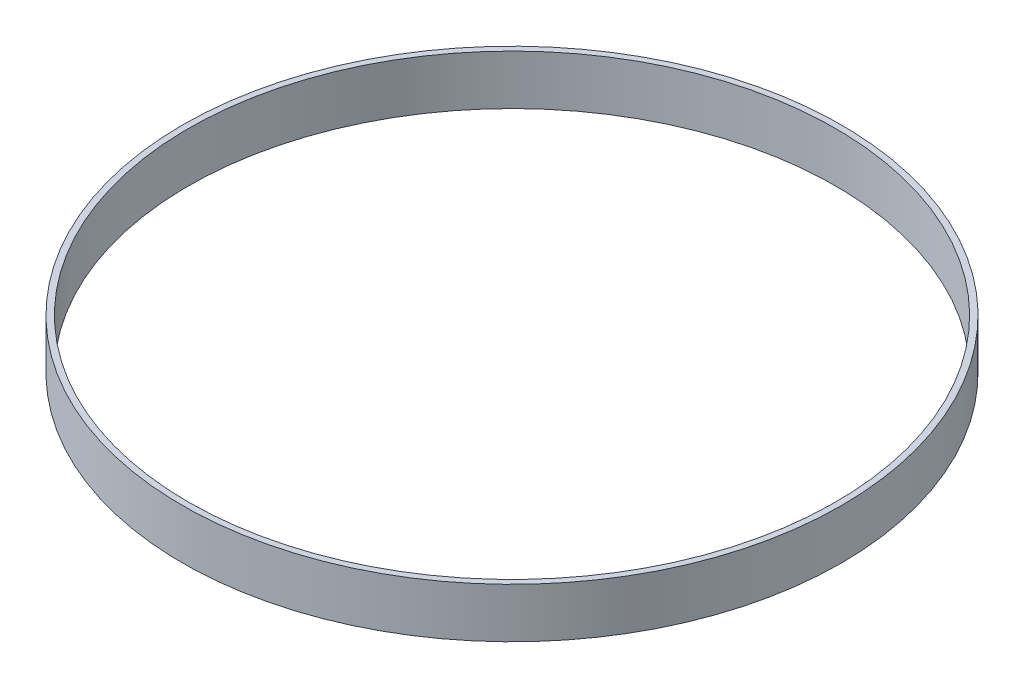
ISO-10303-21;
HEADER;
FILE_DESCRIPTION(('STEP AP214'),'2;1');
FILE_NAME('part.step','',(''),(''),'','','');
FILE_SCHEMA(('AUTOMOTIVE_DESIGN { 1 0 10303 214 1 1 1 1 }'));
ENDSEC;
DATA;
#1=APPLICATION_CONTEXT('core data for automotive mechanical design processes');
#2=APPLICATION_PROTOCOL_DEFINITION('international standard','automotive_design',2000,#1);
#3=PRODUCT_CONTEXT('',#1,'mechanical');
#4=PRODUCT('Part','Part','',(#3));
#5=PRODUCT_RELATED_PRODUCT_CATEGORY('part','',(#4));
#6=PRODUCT_DEFINITION_FORMATION('','',#4);
#7=PRODUCT_DEFINITION_CONTEXT('part definition',#1,'design');
#8=PRODUCT_DEFINITION('design','',#6,#7);
#9=PRODUCT_DEFINITION_SHAPE('','',#8);
#10=(LENGTH_UNIT() NAMED_UNIT(*) SI_UNIT(.MILLI.,.METRE.));
#11=(NAMED_UNIT(*) PLANE_ANGLE_UNIT() SI_UNIT($,.RADIAN.));
#12=(NAMED_UNIT(*) SI_UNIT($,.STERADIAN.) SOLID_ANGLE_UNIT());
#13=UNCERTAINTY_MEASURE_WITH_UNIT(LENGTH_MEASURE(1.E-05),#10,'distance_accuracy_value','');
#14=(GEOMETRIC_REPRESENTATION_CONTEXT(3) GLOBAL_UNCERTAINTY_ASSIGNED_CONTEXT((#13)) GLOBAL_UNIT_ASSIGNED_CONTEXT((#10,
#11,#12)) REPRESENTATION_CONTEXT('',''));
#15=CARTESIAN_POINT('',(0.,0.,0.));
#16=DIRECTION('',(0.,0.,1.));
#17=DIRECTION('',(1.,0.,0.));
#18=AXIS2_PLACEMENT_3D('',#15,#16,#17);
#19=CARTESIAN_POINT('',(0.,10.,0.));
#20=DIRECTION('',(0.,1.,0.));
#21=DIRECTION('',(0.,0.,1.));
#22=AXIS2_PLACEMENT_3D('',#19,#20,#21);
#23=PLANE('',#22);
#24=CARTESIAN_POINT('',(0.,10.,0.));
#25=DIRECTION('',(0.,1.,0.));
#26=DIRECTION('',(1.,0.,0.));
#27=AXIS2_PLACEMENT_3D('',#24,#25,#26);
#28=CIRCLE('',#27,66.2);
#29=CARTESIAN_POINT('',(66.2,10.,0.));
#30=VERTEX_POINT('',#29);
#31=EDGE_CURVE('E11',#30,#30,#28,.T.);
#32=ORIENTED_EDGE('',*,*,#31,.T.);
#33=EDGE_LOOP('',(#32));
#34=FACE_BOUND('',#33,.T.);
#35=CARTESIAN_POINT('',(0.,10.,0.));
#36=DIRECTION('',(0.,1.,0.));
#37=DIRECTION('',(0.,0.,1.));
#38=AXIS2_PLACEMENT_3D('',#35,#36,#37);
#39=CIRCLE('',#38,65.);
#40=CARTESIAN_POINT('',(0.,10.,65.));
#41=VERTEX_POINT('',#40);
#42=EDGE_CURVE('E62',#41,#41,#39,.T.);
#43=ORIENTED_EDGE('',*,*,#42,.F.);
#44=EDGE_LOOP('',(#43));
#45=FACE_BOUND('',#44,.T.);
#46=ADVANCED_FACE('F49',(#34,#45),#23,.T.);
#47=CARTESIAN_POINT('',(0.,0.,0.));
#48=DIRECTION('',(0.,1.,0.));
#49=DIRECTION('',(0.,0.,1.));
#50=AXIS2_PLACEMENT_3D('',#47,#48,#49);
#51=PLANE('',#50);
#52=CARTESIAN_POINT('',(0.,0.,0.));
#53=DIRECTION('',(0.,1.,0.));
#54=DIRECTION('',(1.,0.,0.));
#55=AXIS2_PLACEMENT_3D('',#52,#53,#54);
#56=CIRCLE('',#55,66.2);
#57=CARTESIAN_POINT('',(66.2,0.,0.));
#58=VERTEX_POINT('',#57);
#59=EDGE_CURVE('E53',#58,#58,#56,.T.);
#60=ORIENTED_EDGE('',*,*,#59,.F.);
#61=EDGE_LOOP('',(#60));
#62=FACE_BOUND('',#61,.T.);
#63=CARTESIAN_POINT('',(0.,0.,0.));
#64=DIRECTION('',(0.,1.,0.));
#65=DIRECTION('',(0.,0.,1.));
#66=AXIS2_PLACEMENT_3D('',#63,#64,#65);
#67=CIRCLE('',#66,65.);
#68=CARTESIAN_POINT('',(0.,0.,65.));
#69=VERTEX_POINT('',#68);
#70=EDGE_CURVE('E64',#69,#69,#67,.T.);
#71=ORIENTED_EDGE('',*,*,#70,.T.);
#72=EDGE_LOOP('',(#71));
#73=FACE_BOUND('',#72,.T.);
#74=ADVANCED_FACE('F76',(#62,#73),#51,.F.);
#75=CARTESIAN_POINT('',(0.,10.,0.));
#76=DIRECTION('',(0.,-1.,0.));
#77=DIRECTION('',(0.,0.,-1.));
#78=AXIS2_PLACEMENT_3D('',#75,#76,#77);
#79=CYLINDRICAL_SURFACE('',#78,66.2);
#80=ORIENTED_EDGE('',*,*,#31,.F.);
#81=EDGE_LOOP('',(#80));
#82=FACE_BOUND('',#81,.T.);
#83=ORIENTED_EDGE('',*,*,#59,.T.);
#84=EDGE_LOOP('',(#83));
#85=FACE_BOUND('',#84,.T.);
#86=ADVANCED_FACE('F51',(#82,#85),#79,.T.);
#87=CARTESIAN_POINT('',(0.,10.,0.));
#88=DIRECTION('',(0.,-1.,0.));
#89=DIRECTION('',(0.,0.,-1.));
#90=AXIS2_PLACEMENT_3D('',#87,#88,#89);
#91=CYLINDRICAL_SURFACE('',#90,65.);
#92=ORIENTED_EDGE('',*,*,#42,.T.);
#93=EDGE_LOOP('',(#92));
#94=FACE_BOUND('',#93,.T.);
#95=ORIENTED_EDGE('',*,*,#70,.F.);
#96=EDGE_LOOP('',(#95));
#97=FACE_BOUND('',#96,.T.);
#98=ADVANCED_FACE('F72',(#94,#97),#91,.F.);
#99=CLOSED_SHELL('',(#46,#74,#86,#98));
#100=MANIFOLD_SOLID_BREP('B2',#99);
#101=ADVANCED_BREP_SHAPE_REPRESENTATION('',(#18,#100),#14);
#102=SHAPE_DEFINITION_REPRESENTATION(#9,#101);
ENDSEC;
END-ISO-10303-21;
